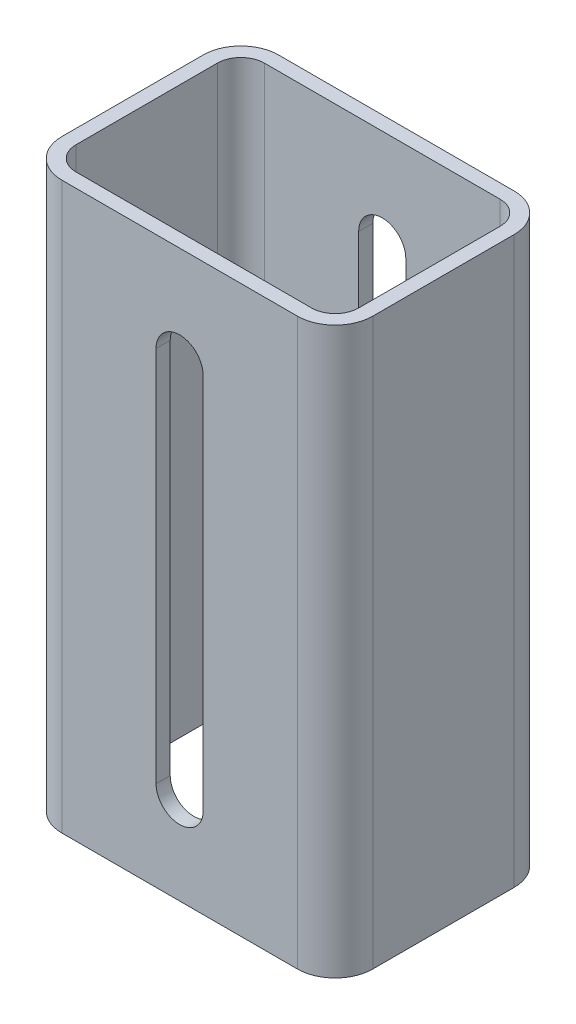
ISO-10303-21;
HEADER;
FILE_DESCRIPTION(('STEP AP214'),'2;1');
FILE_NAME('part.step','',(''),(''),'','','');
FILE_SCHEMA(('AUTOMOTIVE_DESIGN { 1 0 10303 214 1 1 1 1 }'));
ENDSEC;
DATA;
#1=APPLICATION_CONTEXT('core data for automotive mechanical design processes');
#2=APPLICATION_PROTOCOL_DEFINITION('international standard','automotive_design',2000,#1);
#3=PRODUCT_CONTEXT('',#1,'mechanical');
#4=PRODUCT('Part','Part','',(#3));
#5=PRODUCT_RELATED_PRODUCT_CATEGORY('part','',(#4));
#6=PRODUCT_DEFINITION_FORMATION('','',#4);
#7=PRODUCT_DEFINITION_CONTEXT('part definition',#1,'design');
#8=PRODUCT_DEFINITION('design','',#6,#7);
#9=PRODUCT_DEFINITION_SHAPE('','',#8);
#10=(LENGTH_UNIT() NAMED_UNIT(*) SI_UNIT(.MILLI.,.METRE.));
#11=(NAMED_UNIT(*) PLANE_ANGLE_UNIT() SI_UNIT($,.RADIAN.));
#12=(NAMED_UNIT(*) SI_UNIT($,.STERADIAN.) SOLID_ANGLE_UNIT());
#13=UNCERTAINTY_MEASURE_WITH_UNIT(LENGTH_MEASURE(1.E-05),#10,'distance_accuracy_value','');
#14=(GEOMETRIC_REPRESENTATION_CONTEXT(3) GLOBAL_UNCERTAINTY_ASSIGNED_CONTEXT((#13)) GLOBAL_UNIT_ASSIGNED_CONTEXT((#10,
#11,#12)) REPRESENTATION_CONTEXT('',''));
#15=CARTESIAN_POINT('',(0.,0.,0.));
#16=DIRECTION('',(0.,0.,1.));
#17=DIRECTION('',(1.,0.,0.));
#18=AXIS2_PLACEMENT_3D('',#15,#16,#17);
#19=CARTESIAN_POINT('',(-25.,60.,-15.));
#20=DIRECTION('',(0.,-1.,0.));
#21=DIRECTION('',(0.,0.,-1.));
#22=AXIS2_PLACEMENT_3D('',#19,#20,#21);
#23=PLANE('',#22);
#24=CARTESIAN_POINT('',(-25.,60.,-15.));
#25=DIRECTION('',(0.,-1.,0.));
#26=DIRECTION('',(-1.,0.,0.));
#27=AXIS2_PLACEMENT_3D('',#24,#25,#26);
#28=CIRCLE('',#27,8.);
#29=CARTESIAN_POINT('',(-25.,60.,-23.));
#30=VERTEX_POINT('',#29);
#31=CARTESIAN_POINT('',(-33.,60.,-15.));
#32=VERTEX_POINT('',#31);
#33=EDGE_CURVE('E341',#30,#32,#28,.F.);
#34=ORIENTED_EDGE('',*,*,#33,.T.);
#35=DIRECTION('',(0.,0.,1.));
#36=VECTOR('',#35,1.);
#37=CARTESIAN_POINT('',(-33.,60.,-15.));
#38=LINE('',#37,#36);
#39=CARTESIAN_POINT('',(-33.,60.,15.));
#40=VERTEX_POINT('',#39);
#41=EDGE_CURVE('E344',#32,#40,#38,.T.);
#42=ORIENTED_EDGE('',*,*,#41,.T.);
#43=CARTESIAN_POINT('',(-25.,60.,15.));
#44=DIRECTION('',(0.,-1.,0.));
#45=DIRECTION('',(-1.,0.,0.));
#46=AXIS2_PLACEMENT_3D('',#43,#44,#45);
#47=CIRCLE('',#46,8.);
#48=CARTESIAN_POINT('',(-25.,60.,23.));
#49=VERTEX_POINT('',#48);
#50=EDGE_CURVE('E347',#40,#49,#47,.F.);
#51=ORIENTED_EDGE('',*,*,#50,.T.);
#52=DIRECTION('',(1.,0.,0.));
#53=VECTOR('',#52,1.);
#54=CARTESIAN_POINT('',(-25.,60.,23.));
#55=LINE('',#54,#53);
#56=CARTESIAN_POINT('',(25.,60.,23.));
#57=VERTEX_POINT('',#56);
#58=EDGE_CURVE('E349',#49,#57,#55,.T.);
#59=ORIENTED_EDGE('',*,*,#58,.T.);
#60=CARTESIAN_POINT('',(25.,60.,15.));
#61=DIRECTION('',(0.,-1.,0.));
#62=DIRECTION('',(-1.,0.,0.));
#63=AXIS2_PLACEMENT_3D('',#60,#61,#62);
#64=CIRCLE('',#63,8.);
#65=CARTESIAN_POINT('',(33.,60.,15.));
#66=VERTEX_POINT('',#65);
#67=EDGE_CURVE('E351',#57,#66,#64,.F.);
#68=ORIENTED_EDGE('',*,*,#67,.T.);
#69=DIRECTION('',(0.,0.,-1.));
#70=VECTOR('',#69,1.);
#71=CARTESIAN_POINT('',(33.,60.,-15.));
#72=LINE('',#71,#70);
#73=CARTESIAN_POINT('',(33.,60.,-15.));
#74=VERTEX_POINT('',#73);
#75=EDGE_CURVE('E353',#66,#74,#72,.T.);
#76=ORIENTED_EDGE('',*,*,#75,.T.);
#77=CARTESIAN_POINT('',(25.,60.,-15.));
#78=DIRECTION('',(0.,-1.,0.));
#79=DIRECTION('',(-1.,0.,0.));
#80=AXIS2_PLACEMENT_3D('',#77,#78,#79);
#81=CIRCLE('',#80,8.);
#82=CARTESIAN_POINT('',(25.,60.,-23.));
#83=VERTEX_POINT('',#82);
#84=EDGE_CURVE('E355',#74,#83,#81,.F.);
#85=ORIENTED_EDGE('',*,*,#84,.T.);
#86=DIRECTION('',(-1.,0.,0.));
#87=VECTOR('',#86,1.);
#88=CARTESIAN_POINT('',(-25.,60.,-23.));
#89=LINE('',#88,#87);
#90=EDGE_CURVE('E357',#83,#30,#89,.T.);
#91=ORIENTED_EDGE('',*,*,#90,.T.);
#92=EDGE_LOOP('',(#34,#42,#51,#59,#68,#76,#85,#91));
#93=FACE_BOUND('',#92,.T.);
#94=CARTESIAN_POINT('',(-25.,60.,-15.));
#95=DIRECTION('',(0.,1.,0.));
#96=DIRECTION('',(0.,0.,-1.));
#97=AXIS2_PLACEMENT_3D('',#94,#95,#96);
#98=CIRCLE('',#97,5.);
#99=CARTESIAN_POINT('',(-25.,60.,-20.));
#100=VERTEX_POINT('',#99);
#101=CARTESIAN_POINT('',(-30.,60.,-15.));
#102=VERTEX_POINT('',#101);
#103=EDGE_CURVE('E281',#100,#102,#98,.T.);
#104=ORIENTED_EDGE('',*,*,#103,.F.);
#105=DIRECTION('',(-1.,0.,0.));
#106=VECTOR('',#105,1.);
#107=CARTESIAN_POINT('',(-25.,60.,-20.));
#108=LINE('',#107,#106);
#109=CARTESIAN_POINT('',(25.,60.,-20.));
#110=VERTEX_POINT('',#109);
#111=EDGE_CURVE('E297',#110,#100,#108,.T.);
#112=ORIENTED_EDGE('',*,*,#111,.F.);
#113=CARTESIAN_POINT('',(25.,60.,-15.));
#114=DIRECTION('',(0.,1.,0.));
#115=DIRECTION('',(0.,0.,1.));
#116=AXIS2_PLACEMENT_3D('',#113,#114,#115);
#117=CIRCLE('',#116,5.);
#118=CARTESIAN_POINT('',(30.,60.,-15.));
#119=VERTEX_POINT('',#118);
#120=EDGE_CURVE('E294',#119,#110,#117,.T.);
#121=ORIENTED_EDGE('',*,*,#120,.F.);
#122=DIRECTION('',(0.,0.,-1.));
#123=VECTOR('',#122,1.);
#124=CARTESIAN_POINT('',(30.,60.,-15.));
#125=LINE('',#124,#123);
#126=CARTESIAN_POINT('',(30.,60.,15.));
#127=VERTEX_POINT('',#126);
#128=EDGE_CURVE('E292',#127,#119,#125,.T.);
#129=ORIENTED_EDGE('',*,*,#128,.F.);
#130=CARTESIAN_POINT('',(25.,60.,15.));
#131=DIRECTION('',(0.,1.,0.));
#132=DIRECTION('',(0.,0.,1.));
#133=AXIS2_PLACEMENT_3D('',#130,#131,#132);
#134=CIRCLE('',#133,5.);
#135=CARTESIAN_POINT('',(25.,60.,20.));
#136=VERTEX_POINT('',#135);
#137=EDGE_CURVE('E290',#136,#127,#134,.T.);
#138=ORIENTED_EDGE('',*,*,#137,.F.);
#139=DIRECTION('',(1.,0.,0.));
#140=VECTOR('',#139,1.);
#141=CARTESIAN_POINT('',(-25.,60.,20.));
#142=LINE('',#141,#140);
#143=CARTESIAN_POINT('',(-25.,60.,20.));
#144=VERTEX_POINT('',#143);
#145=EDGE_CURVE('E288',#144,#136,#142,.T.);
#146=ORIENTED_EDGE('',*,*,#145,.F.);
#147=CARTESIAN_POINT('',(-25.,60.,15.));
#148=DIRECTION('',(0.,1.,0.));
#149=DIRECTION('',(0.,0.,-1.));
#150=AXIS2_PLACEMENT_3D('',#147,#148,#149);
#151=CIRCLE('',#150,5.);
#152=CARTESIAN_POINT('',(-30.,60.,15.));
#153=VERTEX_POINT('',#152);
#154=EDGE_CURVE('E286',#153,#144,#151,.T.);
#155=ORIENTED_EDGE('',*,*,#154,.F.);
#156=DIRECTION('',(0.,0.,1.));
#157=VECTOR('',#156,1.);
#158=CARTESIAN_POINT('',(-30.,60.,-15.));
#159=LINE('',#158,#157);
#160=EDGE_CURVE('E283',#102,#153,#159,.T.);
#161=ORIENTED_EDGE('',*,*,#160,.F.);
#162=EDGE_LOOP('',(#104,#112,#121,#129,#138,#146,#155,#161));
#163=FACE_BOUND('',#162,.T.);
#164=ADVANCED_FACE('F84',(#93,#163),#23,.F.);
#165=CARTESIAN_POINT('',(-25.,-60.,-15.));
#166=DIRECTION('',(0.,-1.,0.));
#167=DIRECTION('',(0.,0.,-1.));
#168=AXIS2_PLACEMENT_3D('',#165,#166,#167);
#169=PLANE('',#168);
#170=CARTESIAN_POINT('',(-25.,-60.,-15.));
#171=DIRECTION('',(0.,-1.,0.));
#172=DIRECTION('',(-1.,0.,0.));
#173=AXIS2_PLACEMENT_3D('',#170,#171,#172);
#174=CIRCLE('',#173,8.);
#175=CARTESIAN_POINT('',(-25.,-60.,-23.));
#176=VERTEX_POINT('',#175);
#177=CARTESIAN_POINT('',(-33.,-60.,-15.));
#178=VERTEX_POINT('',#177);
#179=EDGE_CURVE('E340',#176,#178,#174,.F.);
#180=ORIENTED_EDGE('',*,*,#179,.F.);
#181=DIRECTION('',(-1.,0.,0.));
#182=VECTOR('',#181,1.);
#183=CARTESIAN_POINT('',(-25.,-60.,-23.));
#184=LINE('',#183,#182);
#185=CARTESIAN_POINT('',(25.,-60.,-23.));
#186=VERTEX_POINT('',#185);
#187=EDGE_CURVE('E345',#186,#176,#184,.T.);
#188=ORIENTED_EDGE('',*,*,#187,.F.);
#189=CARTESIAN_POINT('',(25.,-60.,-15.));
#190=DIRECTION('',(0.,-1.,0.));
#191=DIRECTION('',(-1.,0.,0.));
#192=AXIS2_PLACEMENT_3D('',#189,#190,#191);
#193=CIRCLE('',#192,8.);
#194=CARTESIAN_POINT('',(33.,-60.,-15.));
#195=VERTEX_POINT('',#194);
#196=EDGE_CURVE('E372',#195,#186,#193,.F.);
#197=ORIENTED_EDGE('',*,*,#196,.F.);
#198=DIRECTION('',(0.,0.,-1.));
#199=VECTOR('',#198,1.);
#200=CARTESIAN_POINT('',(33.,-60.,-15.));
#201=LINE('',#200,#199);
#202=CARTESIAN_POINT('',(33.,-60.,15.));
#203=VERTEX_POINT('',#202);
#204=EDGE_CURVE('E370',#203,#195,#201,.T.);
#205=ORIENTED_EDGE('',*,*,#204,.F.);
#206=CARTESIAN_POINT('',(25.,-60.,15.));
#207=DIRECTION('',(0.,-1.,0.));
#208=DIRECTION('',(-1.,0.,0.));
#209=AXIS2_PLACEMENT_3D('',#206,#207,#208);
#210=CIRCLE('',#209,8.);
#211=CARTESIAN_POINT('',(25.,-60.,23.));
#212=VERTEX_POINT('',#211);
#213=EDGE_CURVE('E368',#212,#203,#210,.F.);
#214=ORIENTED_EDGE('',*,*,#213,.F.);
#215=DIRECTION('',(1.,0.,0.));
#216=VECTOR('',#215,1.);
#217=CARTESIAN_POINT('',(-25.,-60.,23.));
#218=LINE('',#217,#216);
#219=CARTESIAN_POINT('',(-25.,-60.,23.));
#220=VERTEX_POINT('',#219);
#221=EDGE_CURVE('E366',#220,#212,#218,.T.);
#222=ORIENTED_EDGE('',*,*,#221,.F.);
#223=CARTESIAN_POINT('',(-25.,-60.,15.));
#224=DIRECTION('',(0.,-1.,0.));
#225=DIRECTION('',(-1.,0.,0.));
#226=AXIS2_PLACEMENT_3D('',#223,#224,#225);
#227=CIRCLE('',#226,8.);
#228=CARTESIAN_POINT('',(-33.,-60.,15.));
#229=VERTEX_POINT('',#228);
#230=EDGE_CURVE('E364',#229,#220,#227,.F.);
#231=ORIENTED_EDGE('',*,*,#230,.F.);
#232=DIRECTION('',(0.,0.,1.));
#233=VECTOR('',#232,1.);
#234=CARTESIAN_POINT('',(-33.,-60.,-15.));
#235=LINE('',#234,#233);
#236=EDGE_CURVE('E362',#178,#229,#235,.T.);
#237=ORIENTED_EDGE('',*,*,#236,.F.);
#238=EDGE_LOOP('',(#180,#188,#197,#205,#214,#222,#231,#237));
#239=FACE_BOUND('',#238,.T.);
#240=DIRECTION('',(-1.,0.,0.));
#241=VECTOR('',#240,1.);
#242=CARTESIAN_POINT('',(-25.,-60.,-20.));
#243=LINE('',#242,#241);
#244=CARTESIAN_POINT('',(25.,-60.,-20.));
#245=VERTEX_POINT('',#244);
#246=CARTESIAN_POINT('',(-25.,-60.,-20.));
#247=VERTEX_POINT('',#246);
#248=EDGE_CURVE('E284',#245,#247,#243,.T.);
#249=ORIENTED_EDGE('',*,*,#248,.T.);
#250=CARTESIAN_POINT('',(-25.,-60.,-15.));
#251=DIRECTION('',(0.,1.,0.));
#252=DIRECTION('',(0.,0.,-1.));
#253=AXIS2_PLACEMENT_3D('',#250,#251,#252);
#254=CIRCLE('',#253,5.);
#255=CARTESIAN_POINT('',(-30.,-60.,-15.));
#256=VERTEX_POINT('',#255);
#257=EDGE_CURVE('E300',#247,#256,#254,.T.);
#258=ORIENTED_EDGE('',*,*,#257,.T.);
#259=DIRECTION('',(0.,0.,1.));
#260=VECTOR('',#259,1.);
#261=CARTESIAN_POINT('',(-30.,-60.,-15.));
#262=LINE('',#261,#260);
#263=CARTESIAN_POINT('',(-30.,-60.,15.));
#264=VERTEX_POINT('',#263);
#265=EDGE_CURVE('E303',#256,#264,#262,.T.);
#266=ORIENTED_EDGE('',*,*,#265,.T.);
#267=CARTESIAN_POINT('',(-25.,-60.,15.));
#268=DIRECTION('',(0.,1.,0.));
#269=DIRECTION('',(0.,0.,-1.));
#270=AXIS2_PLACEMENT_3D('',#267,#268,#269);
#271=CIRCLE('',#270,5.);
#272=CARTESIAN_POINT('',(-25.,-60.,20.));
#273=VERTEX_POINT('',#272);
#274=EDGE_CURVE('E306',#264,#273,#271,.T.);
#275=ORIENTED_EDGE('',*,*,#274,.T.);
#276=DIRECTION('',(1.,0.,0.));
#277=VECTOR('',#276,1.);
#278=CARTESIAN_POINT('',(-25.,-60.,20.));
#279=LINE('',#278,#277);
#280=CARTESIAN_POINT('',(25.,-60.,20.));
#281=VERTEX_POINT('',#280);
#282=EDGE_CURVE('E309',#273,#281,#279,.T.);
#283=ORIENTED_EDGE('',*,*,#282,.T.);
#284=CARTESIAN_POINT('',(25.,-60.,15.));
#285=DIRECTION('',(0.,1.,0.));
#286=DIRECTION('',(0.,0.,1.));
#287=AXIS2_PLACEMENT_3D('',#284,#285,#286);
#288=CIRCLE('',#287,5.);
#289=CARTESIAN_POINT('',(30.,-60.,15.));
#290=VERTEX_POINT('',#289);
#291=EDGE_CURVE('E312',#281,#290,#288,.T.);
#292=ORIENTED_EDGE('',*,*,#291,.T.);
#293=DIRECTION('',(0.,0.,-1.));
#294=VECTOR('',#293,1.);
#295=CARTESIAN_POINT('',(30.,-60.,-15.));
#296=LINE('',#295,#294);
#297=CARTESIAN_POINT('',(30.,-60.,-15.));
#298=VERTEX_POINT('',#297);
#299=EDGE_CURVE('E315',#290,#298,#296,.T.);
#300=ORIENTED_EDGE('',*,*,#299,.T.);
#301=CARTESIAN_POINT('',(25.,-60.,-15.));
#302=DIRECTION('',(0.,1.,0.));
#303=DIRECTION('',(0.,0.,1.));
#304=AXIS2_PLACEMENT_3D('',#301,#302,#303);
#305=CIRCLE('',#304,5.);
#306=EDGE_CURVE('E318',#298,#245,#305,.T.);
#307=ORIENTED_EDGE('',*,*,#306,.T.);
#308=EDGE_LOOP('',(#249,#258,#266,#275,#283,#292,#300,#307));
#309=FACE_BOUND('',#308,.T.);
#310=ADVANCED_FACE('F455',(#239,#309),#169,.T.);
#311=CARTESIAN_POINT('',(-25.,60.,-15.));
#312=DIRECTION('',(0.,-1.,0.));
#313=DIRECTION('',(0.,0.,-1.));
#314=AXIS2_PLACEMENT_3D('',#311,#312,#313);
#315=CYLINDRICAL_SURFACE('',#314,8.);
#316=ORIENTED_EDGE('',*,*,#179,.T.);
#317=DIRECTION('',(0.,-1.,0.));
#318=VECTOR('',#317,1.);
#319=CARTESIAN_POINT('',(-33.,60.,-15.));
#320=LINE('',#319,#318);
#321=EDGE_CURVE('E395',#32,#178,#320,.T.);
#322=ORIENTED_EDGE('',*,*,#321,.F.);
#323=ORIENTED_EDGE('',*,*,#33,.F.);
#324=DIRECTION('',(0.,-1.,0.));
#325=VECTOR('',#324,1.);
#326=CARTESIAN_POINT('',(-25.,60.,-23.));
#327=LINE('',#326,#325);
#328=EDGE_CURVE('E359',#30,#176,#327,.T.);
#329=ORIENTED_EDGE('',*,*,#328,.T.);
#330=EDGE_LOOP('',(#316,#322,#323,#329));
#331=FACE_BOUND('',#330,.T.);
#332=ADVANCED_FACE('F86',(#331),#315,.T.);
#333=CARTESIAN_POINT('',(-33.,60.,-15.));
#334=DIRECTION('',(1.,0.,0.));
#335=DIRECTION('',(0.,0.,-1.));
#336=AXIS2_PLACEMENT_3D('',#333,#334,#335);
#337=PLANE('',#336);
#338=ORIENTED_EDGE('',*,*,#236,.T.);
#339=DIRECTION('',(0.,-1.,0.));
#340=VECTOR('',#339,1.);
#341=CARTESIAN_POINT('',(-33.,60.,15.));
#342=LINE('',#341,#340);
#343=EDGE_CURVE('E392',#40,#229,#342,.T.);
#344=ORIENTED_EDGE('',*,*,#343,.F.);
#345=ORIENTED_EDGE('',*,*,#41,.F.);
#346=ORIENTED_EDGE('',*,*,#321,.T.);
#347=EDGE_LOOP('',(#338,#344,#345,#346));
#348=FACE_BOUND('',#347,.T.);
#349=ADVANCED_FACE('F486',(#348),#337,.F.);
#350=CARTESIAN_POINT('',(-25.,60.,15.));
#351=DIRECTION('',(0.,-1.,0.));
#352=DIRECTION('',(0.,0.,-1.));
#353=AXIS2_PLACEMENT_3D('',#350,#351,#352);
#354=CYLINDRICAL_SURFACE('',#353,8.);
#355=ORIENTED_EDGE('',*,*,#230,.T.);
#356=DIRECTION('',(0.,-1.,0.));
#357=VECTOR('',#356,1.);
#358=CARTESIAN_POINT('',(-25.,60.,23.));
#359=LINE('',#358,#357);
#360=EDGE_CURVE('E389',#49,#220,#359,.T.);
#361=ORIENTED_EDGE('',*,*,#360,.F.);
#362=ORIENTED_EDGE('',*,*,#50,.F.);
#363=ORIENTED_EDGE('',*,*,#343,.T.);
#364=EDGE_LOOP('',(#355,#361,#362,#363));
#365=FACE_BOUND('',#364,.T.);
#366=ADVANCED_FACE('F484',(#365),#354,.T.);
#367=CARTESIAN_POINT('',(-25.,60.,23.));
#368=DIRECTION('',(0.,0.,-1.));
#369=DIRECTION('',(-1.,0.,0.));
#370=AXIS2_PLACEMENT_3D('',#367,#368,#369);
#371=PLANE('',#370);
#372=DIRECTION('',(0.,-1.,0.));
#373=VECTOR('',#372,1.);
#374=CARTESIAN_POINT('',(5.,-40.93761256512,23.));
#375=LINE('',#374,#373);
#376=CARTESIAN_POINT('',(5.,39.06238743488,23.));
#377=VERTEX_POINT('',#376);
#378=CARTESIAN_POINT('',(5.,-40.93761256512,23.));
#379=VERTEX_POINT('',#378);
#380=EDGE_CURVE('E424',#377,#379,#375,.T.);
#381=ORIENTED_EDGE('',*,*,#380,.T.);
#382=CARTESIAN_POINT('',(0.,-40.93761256512,23.));
#383=DIRECTION('',(0.,0.,-1.));
#384=DIRECTION('',(-1.,0.,0.));
#385=AXIS2_PLACEMENT_3D('',#382,#383,#384);
#386=CIRCLE('',#385,5.);
#387=CARTESIAN_POINT('',(-5.,-40.93761256512,23.));
#388=VERTEX_POINT('',#387);
#389=EDGE_CURVE('E429',#379,#388,#386,.T.);
#390=ORIENTED_EDGE('',*,*,#389,.T.);
#391=DIRECTION('',(0.,1.,0.));
#392=VECTOR('',#391,1.);
#393=CARTESIAN_POINT('',(-5.,-40.93761256512,23.));
#394=LINE('',#393,#392);
#395=CARTESIAN_POINT('',(-5.,39.06238743488,23.));
#396=VERTEX_POINT('',#395);
#397=EDGE_CURVE('E249',#388,#396,#394,.T.);
#398=ORIENTED_EDGE('',*,*,#397,.T.);
#399=CARTESIAN_POINT('',(0.,39.06238743488,23.));
#400=DIRECTION('',(0.,0.,-1.));
#401=DIRECTION('',(-1.,0.,0.));
#402=AXIS2_PLACEMENT_3D('',#399,#400,#401);
#403=CIRCLE('',#402,5.);
#404=EDGE_CURVE('E102',#396,#377,#403,.T.);
#405=ORIENTED_EDGE('',*,*,#404,.T.);
#406=EDGE_LOOP('',(#381,#390,#398,#405));
#407=FACE_BOUND('',#406,.T.);
#408=ORIENTED_EDGE('',*,*,#221,.T.);
#409=DIRECTION('',(0.,-1.,0.));
#410=VECTOR('',#409,1.);
#411=CARTESIAN_POINT('',(25.,60.,23.));
#412=LINE('',#411,#410);
#413=EDGE_CURVE('E386',#57,#212,#412,.T.);
#414=ORIENTED_EDGE('',*,*,#413,.F.);
#415=ORIENTED_EDGE('',*,*,#58,.F.);
#416=ORIENTED_EDGE('',*,*,#360,.T.);
#417=EDGE_LOOP('',(#408,#414,#415,#416));
#418=FACE_BOUND('',#417,.T.);
#419=ADVANCED_FACE('F431',(#407,#418),#371,.F.);
#420=CARTESIAN_POINT('',(25.,60.,15.));
#421=DIRECTION('',(0.,-1.,0.));
#422=DIRECTION('',(0.,0.,-1.));
#423=AXIS2_PLACEMENT_3D('',#420,#421,#422);
#424=CYLINDRICAL_SURFACE('',#423,8.);
#425=ORIENTED_EDGE('',*,*,#213,.T.);
#426=DIRECTION('',(0.,-1.,0.));
#427=VECTOR('',#426,1.);
#428=CARTESIAN_POINT('',(33.,60.,15.));
#429=LINE('',#428,#427);
#430=EDGE_CURVE('E383',#66,#203,#429,.T.);
#431=ORIENTED_EDGE('',*,*,#430,.F.);
#432=ORIENTED_EDGE('',*,*,#67,.F.);
#433=ORIENTED_EDGE('',*,*,#413,.T.);
#434=EDGE_LOOP('',(#425,#431,#432,#433));
#435=FACE_BOUND('',#434,.T.);
#436=ADVANCED_FACE('F477',(#435),#424,.T.);
#437=CARTESIAN_POINT('',(33.,60.,-15.));
#438=DIRECTION('',(-1.,0.,0.));
#439=DIRECTION('',(0.,0.,1.));
#440=AXIS2_PLACEMENT_3D('',#437,#438,#439);
#441=PLANE('',#440);
#442=ORIENTED_EDGE('',*,*,#204,.T.);
#443=DIRECTION('',(0.,-1.,0.));
#444=VECTOR('',#443,1.);
#445=CARTESIAN_POINT('',(33.,60.,-15.));
#446=LINE('',#445,#444);
#447=EDGE_CURVE('E380',#74,#195,#446,.T.);
#448=ORIENTED_EDGE('',*,*,#447,.F.);
#449=ORIENTED_EDGE('',*,*,#75,.F.);
#450=ORIENTED_EDGE('',*,*,#430,.T.);
#451=EDGE_LOOP('',(#442,#448,#449,#450));
#452=FACE_BOUND('',#451,.T.);
#453=ADVANCED_FACE('F473',(#452),#441,.F.);
#454=CARTESIAN_POINT('',(25.,60.,-15.));
#455=DIRECTION('',(0.,-1.,0.));
#456=DIRECTION('',(0.,0.,-1.));
#457=AXIS2_PLACEMENT_3D('',#454,#455,#456);
#458=CYLINDRICAL_SURFACE('',#457,8.);
#459=ORIENTED_EDGE('',*,*,#196,.T.);
#460=DIRECTION('',(0.,-1.,0.));
#461=VECTOR('',#460,1.);
#462=CARTESIAN_POINT('',(25.,60.,-23.));
#463=LINE('',#462,#461);
#464=EDGE_CURVE('E377',#83,#186,#463,.T.);
#465=ORIENTED_EDGE('',*,*,#464,.F.);
#466=ORIENTED_EDGE('',*,*,#84,.F.);
#467=ORIENTED_EDGE('',*,*,#447,.T.);
#468=EDGE_LOOP('',(#459,#465,#466,#467));
#469=FACE_BOUND('',#468,.T.);
#470=ADVANCED_FACE('F470',(#469),#458,.T.);
#471=CARTESIAN_POINT('',(-25.,60.,-23.));
#472=DIRECTION('',(0.,0.,1.));
#473=DIRECTION('',(1.,0.,0.));
#474=AXIS2_PLACEMENT_3D('',#471,#472,#473);
#475=PLANE('',#474);
#476=DIRECTION('',(0.,-1.,0.));
#477=VECTOR('',#476,1.);
#478=CARTESIAN_POINT('',(-5.,-40.93761256512,-23.));
#479=LINE('',#478,#477);
#480=CARTESIAN_POINT('',(-5.,-40.93761256512,-23.));
#481=VERTEX_POINT('',#480);
#482=CARTESIAN_POINT('',(-5.,39.06238743488,-23.));
#483=VERTEX_POINT('',#482);
#484=EDGE_CURVE('E269',#481,#483,#479,.F.);
#485=ORIENTED_EDGE('',*,*,#484,.F.);
#486=CARTESIAN_POINT('',(0.,-40.93761256512,-23.));
#487=DIRECTION('',(0.,0.,-1.));
#488=DIRECTION('',(-1.,0.,0.));
#489=AXIS2_PLACEMENT_3D('',#486,#487,#488);
#490=CIRCLE('',#489,5.);
#491=CARTESIAN_POINT('',(5.,-40.93761256512,-23.));
#492=VERTEX_POINT('',#491);
#493=EDGE_CURVE('E88',#492,#481,#490,.T.);
#494=ORIENTED_EDGE('',*,*,#493,.F.);
#495=DIRECTION('',(0.,1.,0.));
#496=VECTOR('',#495,1.);
#497=CARTESIAN_POINT('',(5.,-40.93761256512,-23.));
#498=LINE('',#497,#496);
#499=CARTESIAN_POINT('',(5.,39.06238743488,-23.));
#500=VERTEX_POINT('',#499);
#501=EDGE_CURVE('E126',#500,#492,#498,.F.);
#502=ORIENTED_EDGE('',*,*,#501,.F.);
#503=CARTESIAN_POINT('',(0.,39.06238743488,-23.));
#504=DIRECTION('',(0.,0.,-1.));
#505=DIRECTION('',(-1.,0.,0.));
#506=AXIS2_PLACEMENT_3D('',#503,#504,#505);
#507=CIRCLE('',#506,5.);
#508=EDGE_CURVE('E278',#483,#500,#507,.T.);
#509=ORIENTED_EDGE('',*,*,#508,.F.);
#510=EDGE_LOOP('',(#485,#494,#502,#509));
#511=FACE_BOUND('',#510,.T.);
#512=ORIENTED_EDGE('',*,*,#187,.T.);
#513=ORIENTED_EDGE('',*,*,#328,.F.);
#514=ORIENTED_EDGE('',*,*,#90,.F.);
#515=ORIENTED_EDGE('',*,*,#464,.T.);
#516=EDGE_LOOP('',(#512,#513,#514,#515));
#517=FACE_BOUND('',#516,.T.);
#518=ADVANCED_FACE('F417',(#511,#517),#475,.F.);
#519=CARTESIAN_POINT('',(-25.,60.,-15.));
#520=DIRECTION('',(0.,-1.,0.));
#521=DIRECTION('',(0.,0.,-1.));
#522=AXIS2_PLACEMENT_3D('',#519,#520,#521);
#523=CYLINDRICAL_SURFACE('',#522,5.);
#524=ORIENTED_EDGE('',*,*,#257,.F.);
#525=DIRECTION('',(0.,-1.,0.));
#526=VECTOR('',#525,1.);
#527=CARTESIAN_POINT('',(-25.,60.,-20.));
#528=LINE('',#527,#526);
#529=EDGE_CURVE('E299',#100,#247,#528,.T.);
#530=ORIENTED_EDGE('',*,*,#529,.F.);
#531=ORIENTED_EDGE('',*,*,#103,.T.);
#532=DIRECTION('',(0.,-1.,0.));
#533=VECTOR('',#532,1.);
#534=CARTESIAN_POINT('',(-30.,60.,-15.));
#535=LINE('',#534,#533);
#536=EDGE_CURVE('E337',#102,#256,#535,.T.);
#537=ORIENTED_EDGE('',*,*,#536,.T.);
#538=EDGE_LOOP('',(#524,#530,#531,#537));
#539=FACE_BOUND('',#538,.T.);
#540=ADVANCED_FACE('F465',(#539),#523,.F.);
#541=CARTESIAN_POINT('',(-30.,60.,-15.));
#542=DIRECTION('',(1.,0.,0.));
#543=DIRECTION('',(0.,0.,-1.));
#544=AXIS2_PLACEMENT_3D('',#541,#542,#543);
#545=PLANE('',#544);
#546=ORIENTED_EDGE('',*,*,#265,.F.);
#547=ORIENTED_EDGE('',*,*,#536,.F.);
#548=ORIENTED_EDGE('',*,*,#160,.T.);
#549=DIRECTION('',(0.,-1.,0.));
#550=VECTOR('',#549,1.);
#551=CARTESIAN_POINT('',(-30.,60.,15.));
#552=LINE('',#551,#550);
#553=EDGE_CURVE('E335',#153,#264,#552,.T.);
#554=ORIENTED_EDGE('',*,*,#553,.T.);
#555=EDGE_LOOP('',(#546,#547,#548,#554));
#556=FACE_BOUND('',#555,.T.);
#557=ADVANCED_FACE('F532',(#556),#545,.T.);
#558=CARTESIAN_POINT('',(-25.,60.,15.));
#559=DIRECTION('',(0.,-1.,0.));
#560=DIRECTION('',(0.,0.,-1.));
#561=AXIS2_PLACEMENT_3D('',#558,#559,#560);
#562=CYLINDRICAL_SURFACE('',#561,5.);
#563=ORIENTED_EDGE('',*,*,#274,.F.);
#564=ORIENTED_EDGE('',*,*,#553,.F.);
#565=ORIENTED_EDGE('',*,*,#154,.T.);
#566=DIRECTION('',(0.,-1.,0.));
#567=VECTOR('',#566,1.);
#568=CARTESIAN_POINT('',(-25.,60.,20.));
#569=LINE('',#568,#567);
#570=EDGE_CURVE('E333',#144,#273,#569,.T.);
#571=ORIENTED_EDGE('',*,*,#570,.T.);
#572=EDGE_LOOP('',(#563,#564,#565,#571));
#573=FACE_BOUND('',#572,.T.);
#574=ADVANCED_FACE('F535',(#573),#562,.F.);
#575=CARTESIAN_POINT('',(-25.,60.,20.));
#576=DIRECTION('',(0.,0.,-1.));
#577=DIRECTION('',(-1.,0.,0.));
#578=AXIS2_PLACEMENT_3D('',#575,#576,#577);
#579=PLANE('',#578);
#580=CARTESIAN_POINT('',(0.,-40.93761256512,20.));
#581=DIRECTION('',(0.,0.,-1.));
#582=DIRECTION('',(-1.,0.,0.));
#583=AXIS2_PLACEMENT_3D('',#580,#581,#582);
#584=CIRCLE('',#583,5.);
#585=CARTESIAN_POINT('',(5.,-40.93761256512,20.));
#586=VERTEX_POINT('',#585);
#587=CARTESIAN_POINT('',(-5.,-40.93761256512,20.));
#588=VERTEX_POINT('',#587);
#589=EDGE_CURVE('E257',#586,#588,#584,.T.);
#590=ORIENTED_EDGE('',*,*,#589,.F.);
#591=DIRECTION('',(0.,-1.,0.));
#592=VECTOR('',#591,1.);
#593=CARTESIAN_POINT('',(5.,60.,20.));
#594=LINE('',#593,#592);
#595=CARTESIAN_POINT('',(5.,39.06238743488,20.));
#596=VERTEX_POINT('',#595);
#597=EDGE_CURVE('E279',#596,#586,#594,.T.);
#598=ORIENTED_EDGE('',*,*,#597,.F.);
#599=CARTESIAN_POINT('',(0.,39.06238743488,20.));
#600=DIRECTION('',(0.,0.,-1.));
#601=DIRECTION('',(-1.,0.,0.));
#602=AXIS2_PLACEMENT_3D('',#599,#600,#601);
#603=CIRCLE('',#602,5.);
#604=CARTESIAN_POINT('',(-5.,39.06238743488,20.));
#605=VERTEX_POINT('',#604);
#606=EDGE_CURVE('E268',#605,#596,#603,.T.);
#607=ORIENTED_EDGE('',*,*,#606,.F.);
#608=DIRECTION('',(0.,1.,0.));
#609=VECTOR('',#608,1.);
#610=CARTESIAN_POINT('',(-5.,60.,20.));
#611=LINE('',#610,#609);
#612=EDGE_CURVE('E246',#588,#605,#611,.T.);
#613=ORIENTED_EDGE('',*,*,#612,.F.);
#614=EDGE_LOOP('',(#590,#598,#607,#613));
#615=FACE_BOUND('',#614,.T.);
#616=ORIENTED_EDGE('',*,*,#282,.F.);
#617=ORIENTED_EDGE('',*,*,#570,.F.);
#618=ORIENTED_EDGE('',*,*,#145,.T.);
#619=DIRECTION('',(0.,-1.,0.));
#620=VECTOR('',#619,1.);
#621=CARTESIAN_POINT('',(25.,60.,20.));
#622=LINE('',#621,#620);
#623=EDGE_CURVE('E331',#136,#281,#622,.T.);
#624=ORIENTED_EDGE('',*,*,#623,.T.);
#625=EDGE_LOOP('',(#616,#617,#618,#624));
#626=FACE_BOUND('',#625,.T.);
#627=ADVANCED_FACE('F265',(#615,#626),#579,.T.);
#628=CARTESIAN_POINT('',(25.,60.,15.));
#629=DIRECTION('',(0.,-1.,0.));
#630=DIRECTION('',(0.,0.,-1.));
#631=AXIS2_PLACEMENT_3D('',#628,#629,#630);
#632=CYLINDRICAL_SURFACE('',#631,5.);
#633=ORIENTED_EDGE('',*,*,#291,.F.);
#634=ORIENTED_EDGE('',*,*,#623,.F.);
#635=ORIENTED_EDGE('',*,*,#137,.T.);
#636=DIRECTION('',(0.,-1.,0.));
#637=VECTOR('',#636,1.);
#638=CARTESIAN_POINT('',(30.,60.,15.));
#639=LINE('',#638,#637);
#640=EDGE_CURVE('E329',#127,#290,#639,.T.);
#641=ORIENTED_EDGE('',*,*,#640,.T.);
#642=EDGE_LOOP('',(#633,#634,#635,#641));
#643=FACE_BOUND('',#642,.T.);
#644=ADVANCED_FACE('F542',(#643),#632,.F.);
#645=CARTESIAN_POINT('',(30.,60.,-15.));
#646=DIRECTION('',(-1.,0.,0.));
#647=DIRECTION('',(0.,0.,1.));
#648=AXIS2_PLACEMENT_3D('',#645,#646,#647);
#649=PLANE('',#648);
#650=ORIENTED_EDGE('',*,*,#299,.F.);
#651=ORIENTED_EDGE('',*,*,#640,.F.);
#652=ORIENTED_EDGE('',*,*,#128,.T.);
#653=DIRECTION('',(0.,-1.,0.));
#654=VECTOR('',#653,1.);
#655=CARTESIAN_POINT('',(30.,60.,-15.));
#656=LINE('',#655,#654);
#657=EDGE_CURVE('E327',#119,#298,#656,.T.);
#658=ORIENTED_EDGE('',*,*,#657,.T.);
#659=EDGE_LOOP('',(#650,#651,#652,#658));
#660=FACE_BOUND('',#659,.T.);
#661=ADVANCED_FACE('F547',(#660),#649,.T.);
#662=CARTESIAN_POINT('',(25.,60.,-15.));
#663=DIRECTION('',(0.,-1.,0.));
#664=DIRECTION('',(0.,0.,-1.));
#665=AXIS2_PLACEMENT_3D('',#662,#663,#664);
#666=CYLINDRICAL_SURFACE('',#665,5.);
#667=ORIENTED_EDGE('',*,*,#306,.F.);
#668=ORIENTED_EDGE('',*,*,#657,.F.);
#669=ORIENTED_EDGE('',*,*,#120,.T.);
#670=DIRECTION('',(0.,-1.,0.));
#671=VECTOR('',#670,1.);
#672=CARTESIAN_POINT('',(25.,60.,-20.));
#673=LINE('',#672,#671);
#674=EDGE_CURVE('E325',#110,#245,#673,.T.);
#675=ORIENTED_EDGE('',*,*,#674,.T.);
#676=EDGE_LOOP('',(#667,#668,#669,#675));
#677=FACE_BOUND('',#676,.T.);
#678=ADVANCED_FACE('F550',(#677),#666,.F.);
#679=CARTESIAN_POINT('',(-25.,60.,-20.));
#680=DIRECTION('',(0.,0.,1.));
#681=DIRECTION('',(1.,0.,0.));
#682=AXIS2_PLACEMENT_3D('',#679,#680,#681);
#683=PLANE('',#682);
#684=CARTESIAN_POINT('',(0.,-40.93761256512,-20.));
#685=DIRECTION('',(0.,0.,1.));
#686=DIRECTION('',(1.,0.,0.));
#687=AXIS2_PLACEMENT_3D('',#684,#685,#686);
#688=CIRCLE('',#687,5.);
#689=CARTESIAN_POINT('',(-5.,-40.93761256512,-20.));
#690=VERTEX_POINT('',#689);
#691=CARTESIAN_POINT('',(5.,-40.93761256512,-20.));
#692=VERTEX_POINT('',#691);
#693=EDGE_CURVE('E12',#690,#692,#688,.T.);
#694=ORIENTED_EDGE('',*,*,#693,.F.);
#695=DIRECTION('',(0.,-1.,0.));
#696=VECTOR('',#695,1.);
#697=CARTESIAN_POINT('',(-5.,60.,-20.));
#698=LINE('',#697,#696);
#699=CARTESIAN_POINT('',(-5.,39.06238743488,-20.));
#700=VERTEX_POINT('',#699);
#701=EDGE_CURVE('E398',#700,#690,#698,.T.);
#702=ORIENTED_EDGE('',*,*,#701,.F.);
#703=CARTESIAN_POINT('',(0.,39.06238743488,-20.));
#704=DIRECTION('',(0.,0.,1.));
#705=DIRECTION('',(1.,0.,0.));
#706=AXIS2_PLACEMENT_3D('',#703,#704,#705);
#707=CIRCLE('',#706,5.);
#708=CARTESIAN_POINT('',(5.,39.06238743488,-20.));
#709=VERTEX_POINT('',#708);
#710=EDGE_CURVE('E400',#709,#700,#707,.T.);
#711=ORIENTED_EDGE('',*,*,#710,.F.);
#712=DIRECTION('',(0.,1.,0.));
#713=VECTOR('',#712,1.);
#714=CARTESIAN_POINT('',(5.,60.,-20.));
#715=LINE('',#714,#713);
#716=EDGE_CURVE('E94',#692,#709,#715,.T.);
#717=ORIENTED_EDGE('',*,*,#716,.F.);
#718=EDGE_LOOP('',(#694,#702,#711,#717));
#719=FACE_BOUND('',#718,.T.);
#720=ORIENTED_EDGE('',*,*,#248,.F.);
#721=ORIENTED_EDGE('',*,*,#674,.F.);
#722=ORIENTED_EDGE('',*,*,#111,.T.);
#723=ORIENTED_EDGE('',*,*,#529,.T.);
#724=EDGE_LOOP('',(#720,#721,#722,#723));
#725=FACE_BOUND('',#724,.T.);
#726=ADVANCED_FACE('F520',(#719,#725),#683,.T.);
#727=CARTESIAN_POINT('',(-5.,-40.93761256512,23.));
#728=DIRECTION('',(-1.,0.,0.));
#729=DIRECTION('',(0.,-1.,0.));
#730=AXIS2_PLACEMENT_3D('',#727,#728,#729);
#731=PLANE('',#730);
#732=DIRECTION('',(0.,0.,-1.));
#733=VECTOR('',#732,1.);
#734=CARTESIAN_POINT('',(-5.,39.06238743488,23.));
#735=LINE('',#734,#733);
#736=EDGE_CURVE('E235',#700,#483,#735,.T.);
#737=ORIENTED_EDGE('',*,*,#736,.F.);
#738=ORIENTED_EDGE('',*,*,#701,.T.);
#739=DIRECTION('',(0.,0.,-1.));
#740=VECTOR('',#739,1.);
#741=CARTESIAN_POINT('',(-5.,-40.93761256512,23.));
#742=LINE('',#741,#740);
#743=EDGE_CURVE('E253',#690,#481,#742,.T.);
#744=ORIENTED_EDGE('',*,*,#743,.T.);
#745=ORIENTED_EDGE('',*,*,#484,.T.);
#746=EDGE_LOOP('',(#737,#738,#744,#745));
#747=FACE_BOUND('',#746,.T.);
#748=ADVANCED_FACE('F557',(#747),#731,.F.);
#749=CARTESIAN_POINT('',(0.,39.06238743488,23.));
#750=DIRECTION('',(0.,0.,-1.));
#751=DIRECTION('',(-1.,0.,0.));
#752=AXIS2_PLACEMENT_3D('',#749,#750,#751);
#753=CYLINDRICAL_SURFACE('',#752,5.);
#754=DIRECTION('',(0.,0.,-1.));
#755=VECTOR('',#754,1.);
#756=CARTESIAN_POINT('',(5.,39.06238743488,23.));
#757=LINE('',#756,#755);
#758=EDGE_CURVE('E408',#709,#500,#757,.T.);
#759=ORIENTED_EDGE('',*,*,#758,.F.);
#760=ORIENTED_EDGE('',*,*,#710,.T.);
#761=ORIENTED_EDGE('',*,*,#736,.T.);
#762=ORIENTED_EDGE('',*,*,#508,.T.);
#763=EDGE_LOOP('',(#759,#760,#761,#762));
#764=FACE_BOUND('',#763,.T.);
#765=ADVANCED_FACE('F407',(#764),#753,.F.);
#766=CARTESIAN_POINT('',(5.,-40.93761256512,23.));
#767=DIRECTION('',(1.,0.,0.));
#768=DIRECTION('',(0.,1.,0.));
#769=AXIS2_PLACEMENT_3D('',#766,#767,#768);
#770=PLANE('',#769);
#771=DIRECTION('',(0.,0.,-1.));
#772=VECTOR('',#771,1.);
#773=CARTESIAN_POINT('',(5.,-40.93761256512,23.));
#774=LINE('',#773,#772);
#775=EDGE_CURVE('E272',#692,#492,#774,.T.);
#776=ORIENTED_EDGE('',*,*,#775,.F.);
#777=ORIENTED_EDGE('',*,*,#716,.T.);
#778=ORIENTED_EDGE('',*,*,#758,.T.);
#779=ORIENTED_EDGE('',*,*,#501,.T.);
#780=EDGE_LOOP('',(#776,#777,#778,#779));
#781=FACE_BOUND('',#780,.T.);
#782=ADVANCED_FACE('F412',(#781),#770,.F.);
#783=CARTESIAN_POINT('',(0.,-40.93761256512,23.));
#784=DIRECTION('',(0.,0.,-1.));
#785=DIRECTION('',(-1.,0.,0.));
#786=AXIS2_PLACEMENT_3D('',#783,#784,#785);
#787=CYLINDRICAL_SURFACE('',#786,5.);
#788=ORIENTED_EDGE('',*,*,#743,.F.);
#789=ORIENTED_EDGE('',*,*,#693,.T.);
#790=ORIENTED_EDGE('',*,*,#775,.T.);
#791=ORIENTED_EDGE('',*,*,#493,.T.);
#792=EDGE_LOOP('',(#788,#789,#790,#791));
#793=FACE_BOUND('',#792,.T.);
#794=ADVANCED_FACE('F420',(#793),#787,.F.);
#795=ORIENTED_EDGE('',*,*,#589,.T.);
#796=EDGE_CURVE('E242',#388,#588,#742,.T.);
#797=ORIENTED_EDGE('',*,*,#796,.F.);
#798=ORIENTED_EDGE('',*,*,#389,.F.);
#799=EDGE_CURVE('E260',#379,#586,#774,.T.);
#800=ORIENTED_EDGE('',*,*,#799,.T.);
#801=EDGE_LOOP('',(#795,#797,#798,#800));
#802=FACE_BOUND('',#801,.T.);
#803=ADVANCED_FACE('F258',(#802),#787,.F.);
#804=ORIENTED_EDGE('',*,*,#597,.T.);
#805=ORIENTED_EDGE('',*,*,#799,.F.);
#806=ORIENTED_EDGE('',*,*,#380,.F.);
#807=EDGE_CURVE('E414',#377,#596,#757,.T.);
#808=ORIENTED_EDGE('',*,*,#807,.T.);
#809=EDGE_LOOP('',(#804,#805,#806,#808));
#810=FACE_BOUND('',#809,.T.);
#811=ADVANCED_FACE('F444',(#810),#770,.F.);
#812=ORIENTED_EDGE('',*,*,#606,.T.);
#813=ORIENTED_EDGE('',*,*,#807,.F.);
#814=ORIENTED_EDGE('',*,*,#404,.F.);
#815=EDGE_CURVE('E276',#396,#605,#735,.T.);
#816=ORIENTED_EDGE('',*,*,#815,.T.);
#817=EDGE_LOOP('',(#812,#813,#814,#816));
#818=FACE_BOUND('',#817,.T.);
#819=ADVANCED_FACE('F443',(#818),#753,.F.);
#820=ORIENTED_EDGE('',*,*,#612,.T.);
#821=ORIENTED_EDGE('',*,*,#815,.F.);
#822=ORIENTED_EDGE('',*,*,#397,.F.);
#823=ORIENTED_EDGE('',*,*,#796,.T.);
#824=EDGE_LOOP('',(#820,#821,#822,#823));
#825=FACE_BOUND('',#824,.T.);
#826=ADVANCED_FACE('F244',(#825),#731,.F.);
#827=CLOSED_SHELL('',(#164,#310,#332,#349,#366,#419,#436,#453,#470,#518,#540,#557,#574,#627,
#644,#661,#678,#726,#748,#765,#782,#794,#803,#811,#819,#826));
#828=MANIFOLD_SOLID_BREP('B2',#827);
#829=ADVANCED_BREP_SHAPE_REPRESENTATION('',(#18,#828),#14);
#830=SHAPE_DEFINITION_REPRESENTATION(#9,#829);
ENDSEC;
END-ISO-10303-21;
